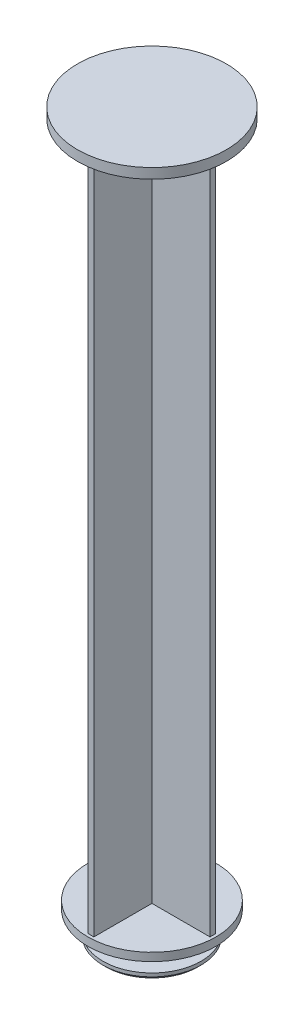
ISO-10303-21;
HEADER;
FILE_DESCRIPTION(('STEP AP214'),'2;1');
FILE_NAME('part.step','',(''),(''),'','','');
FILE_SCHEMA(('AUTOMOTIVE_DESIGN { 1 0 10303 214 1 1 1 1 }'));
ENDSEC;
DATA;
#1=APPLICATION_CONTEXT('core data for automotive mechanical design processes');
#2=APPLICATION_PROTOCOL_DEFINITION('international standard','automotive_design',2000,#1);
#3=PRODUCT_CONTEXT('',#1,'mechanical');
#4=PRODUCT('Part','Part','',(#3));
#5=PRODUCT_RELATED_PRODUCT_CATEGORY('part','',(#4));
#6=PRODUCT_DEFINITION_FORMATION('','',#4);
#7=PRODUCT_DEFINITION_CONTEXT('part definition',#1,'design');
#8=PRODUCT_DEFINITION('design','',#6,#7);
#9=PRODUCT_DEFINITION_SHAPE('','',#8);
#10=(LENGTH_UNIT() NAMED_UNIT(*) SI_UNIT(.MILLI.,.METRE.));
#11=(NAMED_UNIT(*) PLANE_ANGLE_UNIT() SI_UNIT($,.RADIAN.));
#12=(NAMED_UNIT(*) SI_UNIT($,.STERADIAN.) SOLID_ANGLE_UNIT());
#13=UNCERTAINTY_MEASURE_WITH_UNIT(LENGTH_MEASURE(1.E-05),#10,'distance_accuracy_value','');
#14=(GEOMETRIC_REPRESENTATION_CONTEXT(3) GLOBAL_UNCERTAINTY_ASSIGNED_CONTEXT((#13)) GLOBAL_UNIT_ASSIGNED_CONTEXT((#10,
#11,#12)) REPRESENTATION_CONTEXT('',''));
#15=CARTESIAN_POINT('',(0.,0.,0.));
#16=DIRECTION('',(0.,0.,1.));
#17=DIRECTION('',(1.,0.,0.));
#18=AXIS2_PLACEMENT_3D('',#15,#16,#17);
#19=CARTESIAN_POINT('',(0.,5.2,0.));
#20=DIRECTION('',(0.,1.,0.));
#21=DIRECTION('',(0.,0.,1.));
#22=AXIS2_PLACEMENT_3D('',#19,#20,#21);
#23=PLANE('',#22);
#24=CARTESIAN_POINT('',(0.,5.2,0.));
#25=DIRECTION('',(0.,1.,0.));
#26=DIRECTION('',(0.,0.,1.));
#27=AXIS2_PLACEMENT_3D('',#24,#25,#26);
#28=CIRCLE('',#27,9.45);
#29=CARTESIAN_POINT('',(0.,5.2,9.45));
#30=VERTEX_POINT('',#29);
#31=EDGE_CURVE('E331',#30,#30,#28,.T.);
#32=ORIENTED_EDGE('',*,*,#31,.T.);
#33=EDGE_LOOP('',(#32));
#34=FACE_BOUND('',#33,.T.);
#35=DIRECTION('',(0.,0.,1.));
#36=VECTOR('',#35,1.);
#37=CARTESIAN_POINT('',(-8.99999999999999,5.2,0.425000000000032));
#38=LINE('',#37,#36);
#39=CARTESIAN_POINT('',(-9.,5.2,-0.424999999999968));
#40=VERTEX_POINT('',#39);
#41=CARTESIAN_POINT('',(-8.99999999999999,5.2,0.425000000000032));
#42=VERTEX_POINT('',#41);
#43=EDGE_CURVE('E227',#40,#42,#38,.T.);
#44=ORIENTED_EDGE('',*,*,#43,.F.);
#45=DIRECTION('',(-1.,0.,0.));
#46=VECTOR('',#45,1.);
#47=CARTESIAN_POINT('',(-9.,5.2,-0.424999999999968));
#48=LINE('',#47,#46);
#49=CARTESIAN_POINT('',(-0.425,5.2,-0.424999999999999));
#50=VERTEX_POINT('',#49);
#51=EDGE_CURVE('E228',#50,#40,#48,.T.);
#52=ORIENTED_EDGE('',*,*,#51,.F.);
#53=DIRECTION('',(0.,0.,1.));
#54=VECTOR('',#53,1.);
#55=CARTESIAN_POINT('',(-0.425000000000001,5.2,-9.));
#56=LINE('',#55,#54);
#57=CARTESIAN_POINT('',(-0.425000000000001,5.2,-9.));
#58=VERTEX_POINT('',#57);
#59=EDGE_CURVE('E314',#58,#50,#56,.T.);
#60=ORIENTED_EDGE('',*,*,#59,.F.);
#61=DIRECTION('',(-1.,0.,0.));
#62=VECTOR('',#61,1.);
#63=CARTESIAN_POINT('',(-0.425000000000001,5.2,-9.));
#64=LINE('',#63,#62);
#65=CARTESIAN_POINT('',(0.424999999999999,5.2,-9.));
#66=VERTEX_POINT('',#65);
#67=EDGE_CURVE('E311',#66,#58,#64,.T.);
#68=ORIENTED_EDGE('',*,*,#67,.F.);
#69=DIRECTION('',(0.,0.,-1.));
#70=VECTOR('',#69,1.);
#71=CARTESIAN_POINT('',(0.424999999999999,5.2,-9.));
#72=LINE('',#71,#70);
#73=CARTESIAN_POINT('',(0.425,5.2,-0.425000000000002));
#74=VERTEX_POINT('',#73);
#75=EDGE_CURVE('E293',#74,#66,#72,.T.);
#76=ORIENTED_EDGE('',*,*,#75,.F.);
#77=CARTESIAN_POINT('',(9.,5.2,-0.425000000000033));
#78=VERTEX_POINT('',#77);
#79=EDGE_CURVE('E225',#78,#74,#48,.T.);
#80=ORIENTED_EDGE('',*,*,#79,.F.);
#81=DIRECTION('',(0.,0.,-1.));
#82=VECTOR('',#81,1.);
#83=CARTESIAN_POINT('',(9.00000000000001,5.2,0.424999999999967));
#84=LINE('',#83,#82);
#85=CARTESIAN_POINT('',(9.00000000000001,5.2,0.424999999999967));
#86=VERTEX_POINT('',#85);
#87=EDGE_CURVE('E212',#86,#78,#84,.T.);
#88=ORIENTED_EDGE('',*,*,#87,.F.);
#89=DIRECTION('',(1.,0.,0.));
#90=VECTOR('',#89,1.);
#91=CARTESIAN_POINT('',(-8.99999999999999,5.2,0.425000000000032));
#92=LINE('',#91,#90);
#93=CARTESIAN_POINT('',(0.425,5.2,0.424999999999998));
#94=VERTEX_POINT('',#93);
#95=EDGE_CURVE('E230',#94,#86,#92,.T.);
#96=ORIENTED_EDGE('',*,*,#95,.F.);
#97=CARTESIAN_POINT('',(0.425000000000001,5.2,9.));
#98=VERTEX_POINT('',#97);
#99=EDGE_CURVE('E308',#98,#94,#72,.T.);
#100=ORIENTED_EDGE('',*,*,#99,.F.);
#101=DIRECTION('',(1.,0.,0.));
#102=VECTOR('',#101,1.);
#103=CARTESIAN_POINT('',(-0.424999999999999,5.2,9.));
#104=LINE('',#103,#102);
#105=CARTESIAN_POINT('',(-0.424999999999999,5.2,9.));
#106=VERTEX_POINT('',#105);
#107=EDGE_CURVE('E317',#106,#98,#104,.T.);
#108=ORIENTED_EDGE('',*,*,#107,.F.);
#109=CARTESIAN_POINT('',(-0.425,5.2,0.425000000000001));
#110=VERTEX_POINT('',#109);
#111=EDGE_CURVE('E313',#110,#106,#56,.T.);
#112=ORIENTED_EDGE('',*,*,#111,.F.);
#113=EDGE_CURVE('E231',#42,#110,#92,.T.);
#114=ORIENTED_EDGE('',*,*,#113,.F.);
#115=EDGE_LOOP('',(#44,#52,#60,#68,#76,#80,#88,#96,#100,#108,#112,#114));
#116=FACE_BOUND('',#115,.T.);
#117=ADVANCED_FACE('F33',(#34,#116),#23,.T.);
#118=CARTESIAN_POINT('',(0.424999999999999,105.2,-9.));
#119=DIRECTION('',(-1.,0.,0.));
#120=DIRECTION('',(0.,0.,1.));
#121=AXIS2_PLACEMENT_3D('',#118,#119,#120);
#122=PLANE('',#121);
#123=DIRECTION('',(0.,1.,0.));
#124=VECTOR('',#123,1.);
#125=CARTESIAN_POINT('',(0.425,105.2,-0.425000000000002));
#126=LINE('',#125,#124);
#127=CARTESIAN_POINT('',(0.425,105.2,-0.425));
#128=VERTEX_POINT('',#127);
#129=EDGE_CURVE('E56',#74,#128,#126,.T.);
#130=ORIENTED_EDGE('',*,*,#129,.F.);
#131=ORIENTED_EDGE('',*,*,#75,.T.);
#132=DIRECTION('',(0.,-1.,0.));
#133=VECTOR('',#132,1.);
#134=CARTESIAN_POINT('',(0.424999999999999,105.2,-9.));
#135=LINE('',#134,#133);
#136=CARTESIAN_POINT('',(0.424999999999999,105.2,-9.));
#137=VERTEX_POINT('',#136);
#138=EDGE_CURVE('E327',#137,#66,#135,.T.);
#139=ORIENTED_EDGE('',*,*,#138,.F.);
#140=DIRECTION('',(0.,0.,-1.));
#141=VECTOR('',#140,1.);
#142=CARTESIAN_POINT('',(0.424999999999999,105.2,-9.));
#143=LINE('',#142,#141);
#144=EDGE_CURVE('E297',#128,#137,#143,.T.);
#145=ORIENTED_EDGE('',*,*,#144,.F.);
#146=EDGE_LOOP('',(#130,#131,#139,#145));
#147=FACE_BOUND('',#146,.T.);
#148=ADVANCED_FACE('F447',(#147),#122,.F.);
#149=DIRECTION('',(0.,-1.,0.));
#150=VECTOR('',#149,1.);
#151=CARTESIAN_POINT('',(0.425,105.2,0.424999999999998));
#152=LINE('',#151,#150);
#153=CARTESIAN_POINT('',(0.425000000000002,105.2,0.424999999999998));
#154=VERTEX_POINT('',#153);
#155=EDGE_CURVE('E242',#154,#94,#152,.T.);
#156=ORIENTED_EDGE('',*,*,#155,.F.);
#157=CARTESIAN_POINT('',(0.425000000000001,105.2,9.));
#158=VERTEX_POINT('',#157);
#159=EDGE_CURVE('E294',#158,#154,#143,.T.);
#160=ORIENTED_EDGE('',*,*,#159,.F.);
#161=DIRECTION('',(0.,-1.,0.));
#162=VECTOR('',#161,1.);
#163=CARTESIAN_POINT('',(0.425000000000001,105.2,9.));
#164=LINE('',#163,#162);
#165=EDGE_CURVE('E307',#158,#98,#164,.T.);
#166=ORIENTED_EDGE('',*,*,#165,.T.);
#167=ORIENTED_EDGE('',*,*,#99,.T.);
#168=EDGE_LOOP('',(#156,#160,#166,#167));
#169=FACE_BOUND('',#168,.T.);
#170=ADVANCED_FACE('F453',(#169),#122,.F.);
#171=CARTESIAN_POINT('',(-0.425000000000001,105.2,-9.));
#172=DIRECTION('',(1.,0.,0.));
#173=DIRECTION('',(0.,0.,-1.));
#174=AXIS2_PLACEMENT_3D('',#171,#172,#173);
#175=PLANE('',#174);
#176=DIRECTION('',(0.,-1.,0.));
#177=VECTOR('',#176,1.);
#178=CARTESIAN_POINT('',(-0.425,105.2,-0.424999999999998));
#179=LINE('',#178,#177);
#180=CARTESIAN_POINT('',(-0.425000000000002,105.2,-0.424999999999999));
#181=VERTEX_POINT('',#180);
#182=EDGE_CURVE('E244',#181,#50,#179,.T.);
#183=ORIENTED_EDGE('',*,*,#182,.F.);
#184=DIRECTION('',(0.,0.,1.));
#185=VECTOR('',#184,1.);
#186=CARTESIAN_POINT('',(-0.425000000000001,105.2,-9.));
#187=LINE('',#186,#185);
#188=CARTESIAN_POINT('',(-0.425000000000001,105.2,-9.));
#189=VERTEX_POINT('',#188);
#190=EDGE_CURVE('E301',#189,#181,#187,.T.);
#191=ORIENTED_EDGE('',*,*,#190,.F.);
#192=DIRECTION('',(0.,-1.,0.));
#193=VECTOR('',#192,1.);
#194=CARTESIAN_POINT('',(-0.425000000000001,105.2,-9.));
#195=LINE('',#194,#193);
#196=EDGE_CURVE('E324',#189,#58,#195,.T.);
#197=ORIENTED_EDGE('',*,*,#196,.T.);
#198=ORIENTED_EDGE('',*,*,#59,.T.);
#199=EDGE_LOOP('',(#183,#191,#197,#198));
#200=FACE_BOUND('',#199,.T.);
#201=ADVANCED_FACE('F621',(#200),#175,.F.);
#202=DIRECTION('',(0.,1.,0.));
#203=VECTOR('',#202,1.);
#204=CARTESIAN_POINT('',(-0.425,105.2,0.425000000000002));
#205=LINE('',#204,#203);
#206=CARTESIAN_POINT('',(-0.425,105.2,0.425));
#207=VERTEX_POINT('',#206);
#208=EDGE_CURVE('E48',#110,#207,#205,.T.);
#209=ORIENTED_EDGE('',*,*,#208,.F.);
#210=ORIENTED_EDGE('',*,*,#111,.T.);
#211=DIRECTION('',(0.,-1.,0.));
#212=VECTOR('',#211,1.);
#213=CARTESIAN_POINT('',(-0.424999999999999,105.2,9.));
#214=LINE('',#213,#212);
#215=CARTESIAN_POINT('',(-0.424999999999999,105.2,9.));
#216=VERTEX_POINT('',#215);
#217=EDGE_CURVE('E321',#216,#106,#214,.T.);
#218=ORIENTED_EDGE('',*,*,#217,.F.);
#219=EDGE_CURVE('E300',#207,#216,#187,.T.);
#220=ORIENTED_EDGE('',*,*,#219,.F.);
#221=EDGE_LOOP('',(#209,#210,#218,#220));
#222=FACE_BOUND('',#221,.T.);
#223=ADVANCED_FACE('F477',(#222),#175,.F.);
#224=CARTESIAN_POINT('',(0.,1.,0.));
#225=DIRECTION('',(0.,1.,0.));
#226=DIRECTION('',(0.,0.,1.));
#227=AXIS2_PLACEMENT_3D('',#224,#225,#226);
#228=PLANE('',#227);
#229=CARTESIAN_POINT('',(0.,1.,0.));
#230=DIRECTION('',(0.,1.,0.));
#231=DIRECTION('',(0.,0.,1.));
#232=AXIS2_PLACEMENT_3D('',#229,#230,#231);
#233=CIRCLE('',#232,7.25);
#234=CARTESIAN_POINT('',(0.,1.,7.25));
#235=VERTEX_POINT('',#234);
#236=EDGE_CURVE('E374',#235,#235,#233,.T.);
#237=ORIENTED_EDGE('',*,*,#236,.T.);
#238=EDGE_LOOP('',(#237));
#239=FACE_BOUND('',#238,.T.);
#240=DIRECTION('',(0.,0.,1.));
#241=VECTOR('',#240,1.);
#242=CARTESIAN_POINT('',(-5.5,1.,0.600000000000019));
#243=LINE('',#242,#241);
#244=CARTESIAN_POINT('',(-5.5,1.,-0.599999999999981));
#245=VERTEX_POINT('',#244);
#246=CARTESIAN_POINT('',(-5.5,1.,0.600000000000019));
#247=VERTEX_POINT('',#246);
#248=EDGE_CURVE('E261',#245,#247,#243,.T.);
#249=ORIENTED_EDGE('',*,*,#248,.F.);
#250=DIRECTION('',(-1.,0.,0.));
#251=VECTOR('',#250,1.);
#252=CARTESIAN_POINT('',(-5.5,1.,-0.599999999999981));
#253=LINE('',#252,#251);
#254=CARTESIAN_POINT('',(-0.6,1.,-0.60000000000002));
#255=VERTEX_POINT('',#254);
#256=EDGE_CURVE('E247',#255,#245,#253,.T.);
#257=ORIENTED_EDGE('',*,*,#256,.F.);
#258=DIRECTION('',(0.,0.,1.));
#259=VECTOR('',#258,1.);
#260=CARTESIAN_POINT('',(-0.6,1.,-5.5));
#261=LINE('',#260,#259);
#262=CARTESIAN_POINT('',(-0.6,1.,-5.5));
#263=VERTEX_POINT('',#262);
#264=EDGE_CURVE('E358',#263,#255,#261,.T.);
#265=ORIENTED_EDGE('',*,*,#264,.F.);
#266=DIRECTION('',(-1.,0.,0.));
#267=VECTOR('',#266,1.);
#268=CARTESIAN_POINT('',(-0.6,1.,-5.5));
#269=LINE('',#268,#267);
#270=CARTESIAN_POINT('',(0.6,1.,-5.5));
#271=VERTEX_POINT('',#270);
#272=EDGE_CURVE('E355',#271,#263,#269,.T.);
#273=ORIENTED_EDGE('',*,*,#272,.F.);
#274=DIRECTION('',(0.,0.,-1.));
#275=VECTOR('',#274,1.);
#276=CARTESIAN_POINT('',(0.6,1.,-5.5));
#277=LINE('',#276,#275);
#278=CARTESIAN_POINT('',(0.6,1.,-0.60000000000002));
#279=VERTEX_POINT('',#278);
#280=EDGE_CURVE('E334',#279,#271,#277,.T.);
#281=ORIENTED_EDGE('',*,*,#280,.F.);
#282=CARTESIAN_POINT('',(5.5,1.,-0.600000000000019));
#283=VERTEX_POINT('',#282);
#284=EDGE_CURVE('E258',#283,#279,#253,.T.);
#285=ORIENTED_EDGE('',*,*,#284,.F.);
#286=DIRECTION('',(0.,0.,-1.));
#287=VECTOR('',#286,1.);
#288=CARTESIAN_POINT('',(5.5,1.,0.599999999999981));
#289=LINE('',#288,#287);
#290=CARTESIAN_POINT('',(5.5,1.,0.599999999999981));
#291=VERTEX_POINT('',#290);
#292=EDGE_CURVE('E251',#291,#283,#289,.T.);
#293=ORIENTED_EDGE('',*,*,#292,.F.);
#294=DIRECTION('',(1.,0.,0.));
#295=VECTOR('',#294,1.);
#296=CARTESIAN_POINT('',(-5.5,1.,0.600000000000019));
#297=LINE('',#296,#295);
#298=CARTESIAN_POINT('',(0.6,1.,0.60000000000002));
#299=VERTEX_POINT('',#298);
#300=EDGE_CURVE('E264',#299,#291,#297,.T.);
#301=ORIENTED_EDGE('',*,*,#300,.F.);
#302=CARTESIAN_POINT('',(0.6,1.,5.5));
#303=VERTEX_POINT('',#302);
#304=EDGE_CURVE('E352',#303,#299,#277,.T.);
#305=ORIENTED_EDGE('',*,*,#304,.F.);
#306=DIRECTION('',(1.,0.,0.));
#307=VECTOR('',#306,1.);
#308=CARTESIAN_POINT('',(-0.6,1.,5.5));
#309=LINE('',#308,#307);
#310=CARTESIAN_POINT('',(-0.6,1.,5.5));
#311=VERTEX_POINT('',#310);
#312=EDGE_CURVE('E361',#311,#303,#309,.T.);
#313=ORIENTED_EDGE('',*,*,#312,.F.);
#314=CARTESIAN_POINT('',(-0.6,1.,0.60000000000002));
#315=VERTEX_POINT('',#314);
#316=EDGE_CURVE('E357',#315,#311,#261,.T.);
#317=ORIENTED_EDGE('',*,*,#316,.F.);
#318=EDGE_CURVE('E265',#247,#315,#297,.T.);
#319=ORIENTED_EDGE('',*,*,#318,.F.);
#320=EDGE_LOOP('',(#249,#257,#265,#273,#281,#285,#293,#301,#305,#313,#317,#319));
#321=FACE_BOUND('',#320,.T.);
#322=ADVANCED_FACE('F402',(#239,#321),#228,.T.);
#323=CARTESIAN_POINT('',(0.6,4.,-5.5));
#324=DIRECTION('',(-1.,0.,0.));
#325=DIRECTION('',(0.,0.,1.));
#326=AXIS2_PLACEMENT_3D('',#323,#324,#325);
#327=PLANE('',#326);
#328=DIRECTION('',(0.,1.,0.));
#329=VECTOR('',#328,1.);
#330=CARTESIAN_POINT('',(0.6,4.,-0.600000000000002));
#331=LINE('',#330,#329);
#332=CARTESIAN_POINT('',(0.6,4.,-0.6));
#333=VERTEX_POINT('',#332);
#334=EDGE_CURVE('E290',#279,#333,#331,.T.);
#335=ORIENTED_EDGE('',*,*,#334,.F.);
#336=ORIENTED_EDGE('',*,*,#280,.T.);
#337=DIRECTION('',(0.,-1.,0.));
#338=VECTOR('',#337,1.);
#339=CARTESIAN_POINT('',(0.6,4.,-5.5));
#340=LINE('',#339,#338);
#341=CARTESIAN_POINT('',(0.6,4.,-5.5));
#342=VERTEX_POINT('',#341);
#343=EDGE_CURVE('E371',#342,#271,#340,.T.);
#344=ORIENTED_EDGE('',*,*,#343,.F.);
#345=DIRECTION('',(0.,0.,-1.));
#346=VECTOR('',#345,1.);
#347=CARTESIAN_POINT('',(0.6,4.,-5.5));
#348=LINE('',#347,#346);
#349=EDGE_CURVE('E341',#333,#342,#348,.T.);
#350=ORIENTED_EDGE('',*,*,#349,.F.);
#351=EDGE_LOOP('',(#335,#336,#344,#350));
#352=FACE_BOUND('',#351,.T.);
#353=ADVANCED_FACE('F412',(#352),#327,.F.);
#354=DIRECTION('',(0.,-1.,0.));
#355=VECTOR('',#354,1.);
#356=CARTESIAN_POINT('',(0.6,4.,0.599999999999997));
#357=LINE('',#356,#355);
#358=CARTESIAN_POINT('',(0.6,4.,0.6));
#359=VERTEX_POINT('',#358);
#360=EDGE_CURVE('E284',#359,#299,#357,.T.);
#361=ORIENTED_EDGE('',*,*,#360,.F.);
#362=CARTESIAN_POINT('',(0.6,4.,5.5));
#363=VERTEX_POINT('',#362);
#364=EDGE_CURVE('E337',#363,#359,#348,.T.);
#365=ORIENTED_EDGE('',*,*,#364,.F.);
#366=DIRECTION('',(0.,-1.,0.));
#367=VECTOR('',#366,1.);
#368=CARTESIAN_POINT('',(0.6,4.,5.5));
#369=LINE('',#368,#367);
#370=EDGE_CURVE('E351',#363,#303,#369,.T.);
#371=ORIENTED_EDGE('',*,*,#370,.T.);
#372=ORIENTED_EDGE('',*,*,#304,.T.);
#373=EDGE_LOOP('',(#361,#365,#371,#372));
#374=FACE_BOUND('',#373,.T.);
#375=ADVANCED_FACE('F394',(#374),#327,.F.);
#376=CARTESIAN_POINT('',(-0.6,4.,-5.5));
#377=DIRECTION('',(1.,0.,0.));
#378=DIRECTION('',(0.,0.,-1.));
#379=AXIS2_PLACEMENT_3D('',#376,#377,#378);
#380=PLANE('',#379);
#381=DIRECTION('',(0.,-1.,0.));
#382=VECTOR('',#381,1.);
#383=CARTESIAN_POINT('',(-0.6,4.,-0.599999999999998));
#384=LINE('',#383,#382);
#385=CARTESIAN_POINT('',(-0.6,4.,-0.6));
#386=VERTEX_POINT('',#385);
#387=EDGE_CURVE('E287',#386,#255,#384,.T.);
#388=ORIENTED_EDGE('',*,*,#387,.F.);
#389=DIRECTION('',(0.,0.,1.));
#390=VECTOR('',#389,1.);
#391=CARTESIAN_POINT('',(-0.6,4.,-5.5));
#392=LINE('',#391,#390);
#393=CARTESIAN_POINT('',(-0.6,4.,-5.5));
#394=VERTEX_POINT('',#393);
#395=EDGE_CURVE('E345',#394,#386,#392,.T.);
#396=ORIENTED_EDGE('',*,*,#395,.F.);
#397=DIRECTION('',(0.,-1.,0.));
#398=VECTOR('',#397,1.);
#399=CARTESIAN_POINT('',(-0.6,4.,-5.5));
#400=LINE('',#399,#398);
#401=EDGE_CURVE('E368',#394,#263,#400,.T.);
#402=ORIENTED_EDGE('',*,*,#401,.T.);
#403=ORIENTED_EDGE('',*,*,#264,.T.);
#404=EDGE_LOOP('',(#388,#396,#402,#403));
#405=FACE_BOUND('',#404,.T.);
#406=ADVANCED_FACE('F420',(#405),#380,.F.);
#407=DIRECTION('',(0.,1.,0.));
#408=VECTOR('',#407,1.);
#409=CARTESIAN_POINT('',(-0.6,4.,0.600000000000002));
#410=LINE('',#409,#408);
#411=CARTESIAN_POINT('',(-0.6,4.,0.6));
#412=VERTEX_POINT('',#411);
#413=EDGE_CURVE('E281',#315,#412,#410,.T.);
#414=ORIENTED_EDGE('',*,*,#413,.F.);
#415=ORIENTED_EDGE('',*,*,#316,.T.);
#416=DIRECTION('',(0.,-1.,0.));
#417=VECTOR('',#416,1.);
#418=CARTESIAN_POINT('',(-0.6,4.,5.5));
#419=LINE('',#418,#417);
#420=CARTESIAN_POINT('',(-0.6,4.,5.5));
#421=VERTEX_POINT('',#420);
#422=EDGE_CURVE('E365',#421,#311,#419,.T.);
#423=ORIENTED_EDGE('',*,*,#422,.F.);
#424=EDGE_CURVE('E344',#412,#421,#392,.T.);
#425=ORIENTED_EDGE('',*,*,#424,.F.);
#426=EDGE_LOOP('',(#414,#415,#423,#425));
#427=FACE_BOUND('',#426,.T.);
#428=ADVANCED_FACE('F434',(#427),#380,.F.);
#429=CARTESIAN_POINT('',(0.,4.,0.));
#430=DIRECTION('',(0.,1.,0.));
#431=DIRECTION('',(0.,0.,1.));
#432=AXIS2_PLACEMENT_3D('',#429,#430,#431);
#433=PLANE('',#432);
#434=CARTESIAN_POINT('',(0.,4.,0.));
#435=DIRECTION('',(0.,1.,0.));
#436=DIRECTION('',(0.,0.,1.));
#437=AXIS2_PLACEMENT_3D('',#434,#435,#436);
#438=CIRCLE('',#437,9.45);
#439=CARTESIAN_POINT('',(0.,4.,9.45));
#440=VERTEX_POINT('',#439);
#441=EDGE_CURVE('E330',#440,#440,#438,.T.);
#442=ORIENTED_EDGE('',*,*,#441,.F.);
#443=EDGE_LOOP('',(#442));
#444=FACE_BOUND('',#443,.T.);
#445=DIRECTION('',(1.,0.,0.));
#446=VECTOR('',#445,1.);
#447=CARTESIAN_POINT('',(0.,4.,-0.6));
#448=LINE('',#447,#446);
#449=CARTESIAN_POINT('',(-5.5,4.,-0.599999999999981));
#450=VERTEX_POINT('',#449);
#451=EDGE_CURVE('E11',#450,#386,#448,.T.);
#452=ORIENTED_EDGE('',*,*,#451,.F.);
#453=DIRECTION('',(0.,0.,1.));
#454=VECTOR('',#453,1.);
#455=CARTESIAN_POINT('',(-5.5,4.,0.600000000000019));
#456=LINE('',#455,#454);
#457=CARTESIAN_POINT('',(-5.5,4.,0.600000000000019));
#458=VERTEX_POINT('',#457);
#459=EDGE_CURVE('E250',#450,#458,#456,.T.);
#460=ORIENTED_EDGE('',*,*,#459,.T.);
#461=DIRECTION('',(1.,0.,0.));
#462=VECTOR('',#461,1.);
#463=CARTESIAN_POINT('',(-5.5,4.,0.600000000000019));
#464=LINE('',#463,#462);
#465=EDGE_CURVE('E253',#458,#412,#464,.T.);
#466=ORIENTED_EDGE('',*,*,#465,.T.);
#467=ORIENTED_EDGE('',*,*,#424,.T.);
#468=DIRECTION('',(1.,0.,0.));
#469=VECTOR('',#468,1.);
#470=CARTESIAN_POINT('',(-0.6,4.,5.5));
#471=LINE('',#470,#469);
#472=EDGE_CURVE('E348',#421,#363,#471,.T.);
#473=ORIENTED_EDGE('',*,*,#472,.T.);
#474=ORIENTED_EDGE('',*,*,#364,.T.);
#475=DIRECTION('',(-1.,0.,0.));
#476=VECTOR('',#475,1.);
#477=CARTESIAN_POINT('',(0.,4.,0.6));
#478=LINE('',#477,#476);
#479=CARTESIAN_POINT('',(5.5,4.,0.599999999999981));
#480=VERTEX_POINT('',#479);
#481=EDGE_CURVE('E41',#480,#359,#478,.T.);
#482=ORIENTED_EDGE('',*,*,#481,.F.);
#483=DIRECTION('',(0.,0.,-1.));
#484=VECTOR('',#483,1.);
#485=CARTESIAN_POINT('',(5.5,4.,0.599999999999981));
#486=LINE('',#485,#484);
#487=CARTESIAN_POINT('',(5.5,4.,-0.600000000000019));
#488=VERTEX_POINT('',#487);
#489=EDGE_CURVE('E255',#480,#488,#486,.T.);
#490=ORIENTED_EDGE('',*,*,#489,.T.);
#491=DIRECTION('',(-1.,0.,0.));
#492=VECTOR('',#491,1.);
#493=CARTESIAN_POINT('',(-5.5,4.,-0.599999999999981));
#494=LINE('',#493,#492);
#495=EDGE_CURVE('E248',#488,#333,#494,.T.);
#496=ORIENTED_EDGE('',*,*,#495,.T.);
#497=ORIENTED_EDGE('',*,*,#349,.T.);
#498=DIRECTION('',(-1.,0.,0.));
#499=VECTOR('',#498,1.);
#500=CARTESIAN_POINT('',(-0.6,4.,-5.5));
#501=LINE('',#500,#499);
#502=EDGE_CURVE('E340',#342,#394,#501,.T.);
#503=ORIENTED_EDGE('',*,*,#502,.T.);
#504=ORIENTED_EDGE('',*,*,#395,.T.);
#505=EDGE_LOOP('',(#452,#460,#466,#467,#473,#474,#482,#490,#496,#497,#503,#504));
#506=FACE_BOUND('',#505,.T.);
#507=ADVANCED_FACE('F389',(#444,#506),#433,.F.);
#508=CARTESIAN_POINT('',(0.,1.,0.));
#509=DIRECTION('',(0.,-1.,0.));
#510=DIRECTION('',(0.,0.,-1.));
#511=AXIS2_PLACEMENT_3D('',#508,#509,#510);
#512=CYLINDRICAL_SURFACE('',#511,7.25);
#513=CARTESIAN_POINT('',(0.,0.5,0.));
#514=DIRECTION('',(0.,1.,0.));
#515=DIRECTION('',(0.,0.,1.));
#516=AXIS2_PLACEMENT_3D('',#513,#514,#515);
#517=CIRCLE('',#516,7.25);
#518=CARTESIAN_POINT('',(0.,0.5,7.25));
#519=VERTEX_POINT('',#518);
#520=EDGE_CURVE('E377',#519,#519,#517,.T.);
#521=ORIENTED_EDGE('',*,*,#520,.T.);
#522=EDGE_LOOP('',(#521));
#523=FACE_BOUND('',#522,.T.);
#524=ORIENTED_EDGE('',*,*,#236,.F.);
#525=EDGE_LOOP('',(#524));
#526=FACE_BOUND('',#525,.T.);
#527=ADVANCED_FACE('F441',(#523,#526),#512,.T.);
#528=CARTESIAN_POINT('',(0.,0.,0.));
#529=DIRECTION('',(0.,1.,0.));
#530=DIRECTION('',(0.,0.,1.));
#531=AXIS2_PLACEMENT_3D('',#528,#529,#530);
#532=PLANE('',#531);
#533=CARTESIAN_POINT('',(0.,0.,0.));
#534=DIRECTION('',(0.,1.,0.));
#535=DIRECTION('',(0.,0.,1.));
#536=AXIS2_PLACEMENT_3D('',#533,#534,#535);
#537=CIRCLE('',#536,6.75);
#538=CARTESIAN_POINT('',(0.,0.,6.75));
#539=VERTEX_POINT('',#538);
#540=EDGE_CURVE('E380',#539,#539,#537,.F.);
#541=ORIENTED_EDGE('',*,*,#540,.T.);
#542=EDGE_LOOP('',(#541));
#543=FACE_BOUND('',#542,.T.);
#544=ADVANCED_FACE('F470',(#543),#532,.F.);
#545=CARTESIAN_POINT('',(0.,0.5,0.));
#546=DIRECTION('',(0.,1.,0.));
#547=DIRECTION('',(0.,0.,1.));
#548=AXIS2_PLACEMENT_3D('',#545,#546,#547);
#549=CONICAL_SURFACE('',#548,7.25,0.785398163397452);
#550=ORIENTED_EDGE('',*,*,#540,.F.);
#551=EDGE_LOOP('',(#550));
#552=FACE_BOUND('',#551,.T.);
#553=ORIENTED_EDGE('',*,*,#520,.F.);
#554=EDGE_LOOP('',(#553));
#555=FACE_BOUND('',#554,.T.);
#556=ADVANCED_FACE('F35',(#552,#555),#549,.T.);
#557=CARTESIAN_POINT('',(-0.6,4.,-5.5));
#558=DIRECTION('',(0.,0.,1.));
#559=DIRECTION('',(1.,0.,0.));
#560=AXIS2_PLACEMENT_3D('',#557,#558,#559);
#561=PLANE('',#560);
#562=ORIENTED_EDGE('',*,*,#272,.T.);
#563=ORIENTED_EDGE('',*,*,#401,.F.);
#564=ORIENTED_EDGE('',*,*,#502,.F.);
#565=ORIENTED_EDGE('',*,*,#343,.T.);
#566=EDGE_LOOP('',(#562,#563,#564,#565));
#567=FACE_BOUND('',#566,.T.);
#568=ADVANCED_FACE('F416',(#567),#561,.F.);
#569=CARTESIAN_POINT('',(-0.6,4.,5.5));
#570=DIRECTION('',(0.,0.,-1.));
#571=DIRECTION('',(-1.,0.,0.));
#572=AXIS2_PLACEMENT_3D('',#569,#570,#571);
#573=PLANE('',#572);
#574=ORIENTED_EDGE('',*,*,#312,.T.);
#575=ORIENTED_EDGE('',*,*,#370,.F.);
#576=ORIENTED_EDGE('',*,*,#472,.F.);
#577=ORIENTED_EDGE('',*,*,#422,.T.);
#578=EDGE_LOOP('',(#574,#575,#576,#577));
#579=FACE_BOUND('',#578,.T.);
#580=ADVANCED_FACE('F397',(#579),#573,.F.);
#581=CARTESIAN_POINT('',(0.,5.2,0.));
#582=DIRECTION('',(0.,-1.,0.));
#583=DIRECTION('',(0.,0.,-1.));
#584=AXIS2_PLACEMENT_3D('',#581,#582,#583);
#585=CYLINDRICAL_SURFACE('',#584,9.45);
#586=ORIENTED_EDGE('',*,*,#31,.F.);
#587=EDGE_LOOP('',(#586));
#588=FACE_BOUND('',#587,.T.);
#589=ORIENTED_EDGE('',*,*,#441,.T.);
#590=EDGE_LOOP('',(#589));
#591=FACE_BOUND('',#590,.T.);
#592=ADVANCED_FACE('F459',(#588,#591),#585,.T.);
#593=CARTESIAN_POINT('',(-0.425000000000001,105.2,-9.));
#594=DIRECTION('',(0.,0.,1.));
#595=DIRECTION('',(1.,0.,0.));
#596=AXIS2_PLACEMENT_3D('',#593,#594,#595);
#597=PLANE('',#596);
#598=ORIENTED_EDGE('',*,*,#67,.T.);
#599=ORIENTED_EDGE('',*,*,#196,.F.);
#600=DIRECTION('',(-1.,0.,0.));
#601=VECTOR('',#600,1.);
#602=CARTESIAN_POINT('',(-0.425000000000001,105.2,-9.));
#603=LINE('',#602,#601);
#604=EDGE_CURVE('E296',#137,#189,#603,.T.);
#605=ORIENTED_EDGE('',*,*,#604,.F.);
#606=ORIENTED_EDGE('',*,*,#138,.T.);
#607=EDGE_LOOP('',(#598,#599,#605,#606));
#608=FACE_BOUND('',#607,.T.);
#609=ADVANCED_FACE('F461',(#608),#597,.F.);
#610=CARTESIAN_POINT('',(-0.424999999999999,105.2,9.));
#611=DIRECTION('',(0.,0.,-1.));
#612=DIRECTION('',(-1.,0.,0.));
#613=AXIS2_PLACEMENT_3D('',#610,#611,#612);
#614=PLANE('',#613);
#615=ORIENTED_EDGE('',*,*,#107,.T.);
#616=ORIENTED_EDGE('',*,*,#165,.F.);
#617=DIRECTION('',(1.,0.,0.));
#618=VECTOR('',#617,1.);
#619=CARTESIAN_POINT('',(-0.424999999999999,105.2,9.));
#620=LINE('',#619,#618);
#621=EDGE_CURVE('E304',#216,#158,#620,.T.);
#622=ORIENTED_EDGE('',*,*,#621,.F.);
#623=ORIENTED_EDGE('',*,*,#217,.T.);
#624=EDGE_LOOP('',(#615,#616,#622,#623));
#625=FACE_BOUND('',#624,.T.);
#626=ADVANCED_FACE('F565',(#625),#614,.F.);
#627=CARTESIAN_POINT('',(5.5,4.,0.599999999999981));
#628=DIRECTION('',(-1.,0.,0.));
#629=DIRECTION('',(0.,0.,1.));
#630=AXIS2_PLACEMENT_3D('',#627,#628,#629);
#631=PLANE('',#630);
#632=ORIENTED_EDGE('',*,*,#292,.T.);
#633=DIRECTION('',(0.,-1.,0.));
#634=VECTOR('',#633,1.);
#635=CARTESIAN_POINT('',(5.5,4.,-0.600000000000019));
#636=LINE('',#635,#634);
#637=EDGE_CURVE('E257',#488,#283,#636,.T.);
#638=ORIENTED_EDGE('',*,*,#637,.F.);
#639=ORIENTED_EDGE('',*,*,#489,.F.);
#640=DIRECTION('',(0.,-1.,0.));
#641=VECTOR('',#640,1.);
#642=CARTESIAN_POINT('',(5.5,4.,0.599999999999981));
#643=LINE('',#642,#641);
#644=EDGE_CURVE('E272',#480,#291,#643,.T.);
#645=ORIENTED_EDGE('',*,*,#644,.T.);
#646=EDGE_LOOP('',(#632,#638,#639,#645));
#647=FACE_BOUND('',#646,.T.);
#648=ADVANCED_FACE('F404',(#647),#631,.F.);
#649=CARTESIAN_POINT('',(-5.5,4.,0.600000000000019));
#650=DIRECTION('',(0.,0.,-1.));
#651=DIRECTION('',(-1.,0.,0.));
#652=AXIS2_PLACEMENT_3D('',#649,#650,#651);
#653=PLANE('',#652);
#654=ORIENTED_EDGE('',*,*,#481,.T.);
#655=ORIENTED_EDGE('',*,*,#360,.T.);
#656=ORIENTED_EDGE('',*,*,#300,.T.);
#657=ORIENTED_EDGE('',*,*,#644,.F.);
#658=EDGE_LOOP('',(#654,#655,#656,#657));
#659=FACE_BOUND('',#658,.T.);
#660=ADVANCED_FACE('F385',(#659),#653,.F.);
#661=CARTESIAN_POINT('',(-5.5,4.,-0.599999999999981));
#662=DIRECTION('',(0.,0.,1.));
#663=DIRECTION('',(1.,0.,0.));
#664=AXIS2_PLACEMENT_3D('',#661,#662,#663);
#665=PLANE('',#664);
#666=ORIENTED_EDGE('',*,*,#284,.T.);
#667=ORIENTED_EDGE('',*,*,#334,.T.);
#668=ORIENTED_EDGE('',*,*,#495,.F.);
#669=ORIENTED_EDGE('',*,*,#637,.T.);
#670=EDGE_LOOP('',(#666,#667,#668,#669));
#671=FACE_BOUND('',#670,.T.);
#672=ADVANCED_FACE('F407',(#671),#665,.F.);
#673=ORIENTED_EDGE('',*,*,#451,.T.);
#674=ORIENTED_EDGE('',*,*,#387,.T.);
#675=ORIENTED_EDGE('',*,*,#256,.T.);
#676=DIRECTION('',(0.,-1.,0.));
#677=VECTOR('',#676,1.);
#678=CARTESIAN_POINT('',(-5.5,4.,-0.599999999999981));
#679=LINE('',#678,#677);
#680=EDGE_CURVE('E278',#450,#245,#679,.T.);
#681=ORIENTED_EDGE('',*,*,#680,.F.);
#682=EDGE_LOOP('',(#673,#674,#675,#681));
#683=FACE_BOUND('',#682,.T.);
#684=ADVANCED_FACE('F423',(#683),#665,.F.);
#685=ORIENTED_EDGE('',*,*,#318,.T.);
#686=ORIENTED_EDGE('',*,*,#413,.T.);
#687=ORIENTED_EDGE('',*,*,#465,.F.);
#688=DIRECTION('',(0.,-1.,0.));
#689=VECTOR('',#688,1.);
#690=CARTESIAN_POINT('',(-5.5,4.,0.600000000000019));
#691=LINE('',#690,#689);
#692=EDGE_CURVE('E275',#458,#247,#691,.T.);
#693=ORIENTED_EDGE('',*,*,#692,.T.);
#694=EDGE_LOOP('',(#685,#686,#687,#693));
#695=FACE_BOUND('',#694,.T.);
#696=ADVANCED_FACE('F431',(#695),#653,.F.);
#697=CARTESIAN_POINT('',(-5.5,4.,0.600000000000019));
#698=DIRECTION('',(1.,0.,0.));
#699=DIRECTION('',(0.,0.,-1.));
#700=AXIS2_PLACEMENT_3D('',#697,#698,#699);
#701=PLANE('',#700);
#702=ORIENTED_EDGE('',*,*,#248,.T.);
#703=ORIENTED_EDGE('',*,*,#692,.F.);
#704=ORIENTED_EDGE('',*,*,#459,.F.);
#705=ORIENTED_EDGE('',*,*,#680,.T.);
#706=EDGE_LOOP('',(#702,#703,#704,#705));
#707=FACE_BOUND('',#706,.T.);
#708=ADVANCED_FACE('F428',(#707),#701,.F.);
#709=CARTESIAN_POINT('',(-8.99999999999999,105.2,0.425000000000032));
#710=DIRECTION('',(0.,0.,-1.));
#711=DIRECTION('',(-1.,0.,0.));
#712=AXIS2_PLACEMENT_3D('',#709,#710,#711);
#713=PLANE('',#712);
#714=ORIENTED_EDGE('',*,*,#113,.T.);
#715=ORIENTED_EDGE('',*,*,#208,.T.);
#716=DIRECTION('',(1.,0.,0.));
#717=VECTOR('',#716,1.);
#718=CARTESIAN_POINT('',(-8.99999999999999,105.2,0.425000000000032));
#719=LINE('',#718,#717);
#720=CARTESIAN_POINT('',(-8.99999999999999,105.2,0.425000000000032));
#721=VERTEX_POINT('',#720);
#722=EDGE_CURVE('E219',#721,#207,#719,.T.);
#723=ORIENTED_EDGE('',*,*,#722,.F.);
#724=DIRECTION('',(0.,-1.,0.));
#725=VECTOR('',#724,1.);
#726=CARTESIAN_POINT('',(-8.99999999999999,105.2,0.425000000000032));
#727=LINE('',#726,#725);
#728=EDGE_CURVE('E235',#721,#42,#727,.T.);
#729=ORIENTED_EDGE('',*,*,#728,.T.);
#730=EDGE_LOOP('',(#714,#715,#723,#729));
#731=FACE_BOUND('',#730,.T.);
#732=ADVANCED_FACE('F605',(#731),#713,.F.);
#733=CARTESIAN_POINT('',(-9.,105.2,-0.424999999999968));
#734=DIRECTION('',(0.,0.,1.));
#735=DIRECTION('',(1.,0.,0.));
#736=AXIS2_PLACEMENT_3D('',#733,#734,#735);
#737=PLANE('',#736);
#738=DIRECTION('',(-1.,0.,0.));
#739=VECTOR('',#738,1.);
#740=CARTESIAN_POINT('',(-9.,105.2,-0.424999999999968));
#741=LINE('',#740,#739);
#742=CARTESIAN_POINT('',(-9.,105.2,-0.424999999999968));
#743=VERTEX_POINT('',#742);
#744=EDGE_CURVE('E203',#181,#743,#741,.T.);
#745=ORIENTED_EDGE('',*,*,#744,.F.);
#746=ORIENTED_EDGE('',*,*,#182,.T.);
#747=ORIENTED_EDGE('',*,*,#51,.T.);
#748=DIRECTION('',(0.,-1.,0.));
#749=VECTOR('',#748,1.);
#750=CARTESIAN_POINT('',(-9.,105.2,-0.424999999999968));
#751=LINE('',#750,#749);
#752=EDGE_CURVE('E238',#743,#40,#751,.T.);
#753=ORIENTED_EDGE('',*,*,#752,.F.);
#754=EDGE_LOOP('',(#745,#746,#747,#753));
#755=FACE_BOUND('',#754,.T.);
#756=ADVANCED_FACE('F656',(#755),#737,.F.);
#757=CARTESIAN_POINT('',(-8.99999999999999,105.2,0.425000000000032));
#758=DIRECTION('',(1.,0.,0.));
#759=DIRECTION('',(0.,0.,-1.));
#760=AXIS2_PLACEMENT_3D('',#757,#758,#759);
#761=PLANE('',#760);
#762=ORIENTED_EDGE('',*,*,#43,.T.);
#763=ORIENTED_EDGE('',*,*,#728,.F.);
#764=DIRECTION('',(0.,0.,1.));
#765=VECTOR('',#764,1.);
#766=CARTESIAN_POINT('',(-8.99999999999999,105.2,0.425000000000032));
#767=LINE('',#766,#765);
#768=EDGE_CURVE('E202',#743,#721,#767,.T.);
#769=ORIENTED_EDGE('',*,*,#768,.F.);
#770=ORIENTED_EDGE('',*,*,#752,.T.);
#771=EDGE_LOOP('',(#762,#763,#769,#770));
#772=FACE_BOUND('',#771,.T.);
#773=ADVANCED_FACE('F666',(#772),#761,.F.);
#774=ORIENTED_EDGE('',*,*,#79,.T.);
#775=ORIENTED_EDGE('',*,*,#129,.T.);
#776=CARTESIAN_POINT('',(9.,105.2,-0.425000000000033));
#777=VERTEX_POINT('',#776);
#778=EDGE_CURVE('E194',#777,#128,#741,.T.);
#779=ORIENTED_EDGE('',*,*,#778,.F.);
#780=DIRECTION('',(0.,-1.,0.));
#781=VECTOR('',#780,1.);
#782=CARTESIAN_POINT('',(9.,105.2,-0.425000000000033));
#783=LINE('',#782,#781);
#784=EDGE_CURVE('E197',#777,#78,#783,.T.);
#785=ORIENTED_EDGE('',*,*,#784,.T.);
#786=EDGE_LOOP('',(#774,#775,#779,#785));
#787=FACE_BOUND('',#786,.T.);
#788=ADVANCED_FACE('F196',(#787),#737,.F.);
#789=CARTESIAN_POINT('',(9.00000000000001,105.2,0.424999999999967));
#790=VERTEX_POINT('',#789);
#791=EDGE_CURVE('E218',#154,#790,#719,.T.);
#792=ORIENTED_EDGE('',*,*,#791,.F.);
#793=ORIENTED_EDGE('',*,*,#155,.T.);
#794=ORIENTED_EDGE('',*,*,#95,.T.);
#795=DIRECTION('',(0.,-1.,0.));
#796=VECTOR('',#795,1.);
#797=CARTESIAN_POINT('',(9.00000000000001,105.2,0.424999999999967));
#798=LINE('',#797,#796);
#799=EDGE_CURVE('E213',#790,#86,#798,.T.);
#800=ORIENTED_EDGE('',*,*,#799,.F.);
#801=EDGE_LOOP('',(#792,#793,#794,#800));
#802=FACE_BOUND('',#801,.T.);
#803=ADVANCED_FACE('F658',(#802),#713,.F.);
#804=CARTESIAN_POINT('',(9.00000000000001,105.2,0.424999999999967));
#805=DIRECTION('',(-1.,0.,0.));
#806=DIRECTION('',(0.,0.,1.));
#807=AXIS2_PLACEMENT_3D('',#804,#805,#806);
#808=PLANE('',#807);
#809=ORIENTED_EDGE('',*,*,#87,.T.);
#810=ORIENTED_EDGE('',*,*,#784,.F.);
#811=DIRECTION('',(0.,0.,-1.));
#812=VECTOR('',#811,1.);
#813=CARTESIAN_POINT('',(9.00000000000001,105.2,0.424999999999967));
#814=LINE('',#813,#812);
#815=EDGE_CURVE('E209',#790,#777,#814,.T.);
#816=ORIENTED_EDGE('',*,*,#815,.F.);
#817=ORIENTED_EDGE('',*,*,#799,.T.);
#818=EDGE_LOOP('',(#809,#810,#816,#817));
#819=FACE_BOUND('',#818,.T.);
#820=ADVANCED_FACE('F207',(#819),#808,.F.);
#821=CARTESIAN_POINT('',(0.,105.2,0.));
#822=DIRECTION('',(0.,1.,0.));
#823=DIRECTION('',(0.,0.,1.));
#824=AXIS2_PLACEMENT_3D('',#821,#822,#823);
#825=PLANE('',#824);
#826=CARTESIAN_POINT('',(0.,105.2,0.));
#827=DIRECTION('',(0.,1.,0.));
#828=DIRECTION('',(0.,0.,1.));
#829=AXIS2_PLACEMENT_3D('',#826,#827,#828);
#830=CIRCLE('',#829,11.);
#831=CARTESIAN_POINT('',(0.,105.2,11.));
#832=VERTEX_POINT('',#831);
#833=EDGE_CURVE('E735',#832,#832,#830,.T.);
#834=ORIENTED_EDGE('',*,*,#833,.F.);
#835=EDGE_LOOP('',(#834));
#836=FACE_BOUND('',#835,.T.);
#837=ORIENTED_EDGE('',*,*,#744,.T.);
#838=ORIENTED_EDGE('',*,*,#768,.T.);
#839=ORIENTED_EDGE('',*,*,#722,.T.);
#840=ORIENTED_EDGE('',*,*,#219,.T.);
#841=ORIENTED_EDGE('',*,*,#621,.T.);
#842=ORIENTED_EDGE('',*,*,#159,.T.);
#843=ORIENTED_EDGE('',*,*,#791,.T.);
#844=ORIENTED_EDGE('',*,*,#815,.T.);
#845=ORIENTED_EDGE('',*,*,#778,.T.);
#846=ORIENTED_EDGE('',*,*,#144,.T.);
#847=ORIENTED_EDGE('',*,*,#604,.T.);
#848=ORIENTED_EDGE('',*,*,#190,.T.);
#849=EDGE_LOOP('',(#837,#838,#839,#840,#841,#842,#843,#844,#845,#846,#847,#848));
#850=FACE_BOUND('',#849,.T.);
#851=ADVANCED_FACE('F216',(#836,#850),#825,.F.);
#852=CARTESIAN_POINT('',(0.,106.7,0.));
#853=DIRECTION('',(0.,-1.,0.));
#854=DIRECTION('',(0.,0.,-1.));
#855=AXIS2_PLACEMENT_3D('',#852,#853,#854);
#856=CYLINDRICAL_SURFACE('',#855,11.);
#857=CARTESIAN_POINT('',(0.,106.7,0.));
#858=DIRECTION('',(0.,1.,0.));
#859=DIRECTION('',(0.,0.,1.));
#860=AXIS2_PLACEMENT_3D('',#857,#858,#859);
#861=CIRCLE('',#860,11.);
#862=CARTESIAN_POINT('',(0.,106.7,11.));
#863=VERTEX_POINT('',#862);
#864=EDGE_CURVE('E734',#863,#863,#861,.T.);
#865=ORIENTED_EDGE('',*,*,#864,.F.);
#866=EDGE_LOOP('',(#865));
#867=FACE_BOUND('',#866,.T.);
#868=ORIENTED_EDGE('',*,*,#833,.T.);
#869=EDGE_LOOP('',(#868));
#870=FACE_BOUND('',#869,.T.);
#871=ADVANCED_FACE('F708',(#867,#870),#856,.T.);
#872=CARTESIAN_POINT('',(0.,106.7,0.));
#873=DIRECTION('',(0.,1.,0.));
#874=DIRECTION('',(0.,0.,1.));
#875=AXIS2_PLACEMENT_3D('',#872,#873,#874);
#876=PLANE('',#875);
#877=ORIENTED_EDGE('',*,*,#864,.T.);
#878=EDGE_LOOP('',(#877));
#879=FACE_BOUND('',#878,.T.);
#880=ADVANCED_FACE('F718',(#879),#876,.T.);
#881=CLOSED_SHELL('',(#117,#148,#170,#201,#223,#322,#353,#375,#406,#428,#507,#527,#544,#556,
#568,#580,#592,#609,#626,#648,#660,#672,#684,#696,#708,#732,#756,#773,#788,#803,#820,#851,#871,#880));
#882=MANIFOLD_SOLID_BREP('B2',#881);
#883=ADVANCED_BREP_SHAPE_REPRESENTATION('',(#18,#882),#14);
#884=SHAPE_DEFINITION_REPRESENTATION(#9,#883);
ENDSEC;
END-ISO-10303-21;
